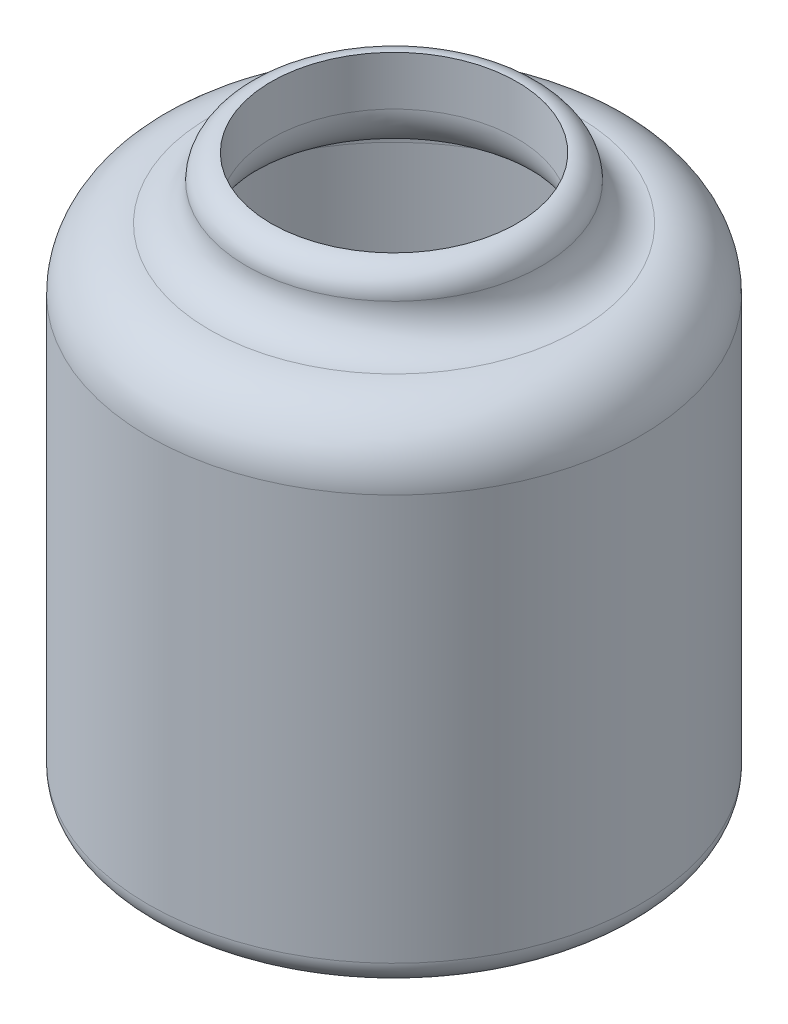
ISO-10303-21;
HEADER;
FILE_DESCRIPTION(('STEP AP214'),'2;1');
FILE_NAME('part.step','',(''),(''),'','','');
FILE_SCHEMA(('AUTOMOTIVE_DESIGN { 1 0 10303 214 1 1 1 1 }'));
ENDSEC;
DATA;
#1=APPLICATION_CONTEXT('core data for automotive mechanical design processes');
#2=APPLICATION_PROTOCOL_DEFINITION('international standard','automotive_design',2000,#1);
#3=PRODUCT_CONTEXT('',#1,'mechanical');
#4=PRODUCT('Part','Part','',(#3));
#5=PRODUCT_RELATED_PRODUCT_CATEGORY('part','',(#4));
#6=PRODUCT_DEFINITION_FORMATION('','',#4);
#7=PRODUCT_DEFINITION_CONTEXT('part definition',#1,'design');
#8=PRODUCT_DEFINITION('design','',#6,#7);
#9=PRODUCT_DEFINITION_SHAPE('','',#8);
#10=(LENGTH_UNIT() NAMED_UNIT(*) SI_UNIT(.MILLI.,.METRE.));
#11=(NAMED_UNIT(*) PLANE_ANGLE_UNIT() SI_UNIT($,.RADIAN.));
#12=(NAMED_UNIT(*) SI_UNIT($,.STERADIAN.) SOLID_ANGLE_UNIT());
#13=UNCERTAINTY_MEASURE_WITH_UNIT(LENGTH_MEASURE(1.E-05),#10,'distance_accuracy_value','');
#14=(GEOMETRIC_REPRESENTATION_CONTEXT(3) GLOBAL_UNCERTAINTY_ASSIGNED_CONTEXT((#13)) GLOBAL_UNIT_ASSIGNED_CONTEXT((#10,
#11,#12)) REPRESENTATION_CONTEXT('',''));
#15=CARTESIAN_POINT('',(0.,0.,0.));
#16=DIRECTION('',(0.,0.,1.));
#17=DIRECTION('',(1.,0.,0.));
#18=AXIS2_PLACEMENT_3D('',#15,#16,#17);
#19=CARTESIAN_POINT('',(0.,200.,0.));
#20=DIRECTION('',(0.,-1.,0.));
#21=DIRECTION('',(0.,0.,-1.));
#22=AXIS2_PLACEMENT_3D('',#19,#20,#21);
#23=CYLINDRICAL_SURFACE('',#22,100.);
#24=CARTESIAN_POINT('',(0.,175.,0.));
#25=DIRECTION('',(0.,1.,0.));
#26=DIRECTION('',(0.,0.,1.));
#27=AXIS2_PLACEMENT_3D('',#24,#25,#26);
#28=CIRCLE('',#27,100.);
#29=CARTESIAN_POINT('',(0.,175.,100.));
#30=VERTEX_POINT('',#29);
#31=EDGE_CURVE('E67',#30,#30,#28,.F.);
#32=ORIENTED_EDGE('',*,*,#31,.T.);
#33=EDGE_LOOP('',(#32));
#34=FACE_BOUND('',#33,.T.);
#35=CARTESIAN_POINT('',(0.,10.,0.));
#36=DIRECTION('',(0.,1.,0.));
#37=DIRECTION('',(0.,0.,1.));
#38=AXIS2_PLACEMENT_3D('',#35,#36,#37);
#39=CIRCLE('',#38,100.);
#40=CARTESIAN_POINT('',(0.,10.,100.));
#41=VERTEX_POINT('',#40);
#42=EDGE_CURVE('E83',#41,#41,#39,.T.);
#43=ORIENTED_EDGE('',*,*,#42,.T.);
#44=EDGE_LOOP('',(#43));
#45=FACE_BOUND('',#44,.T.);
#46=ADVANCED_FACE('F39',(#34,#45),#23,.T.);
#47=CARTESIAN_POINT('',(0.,0.,0.));
#48=DIRECTION('',(0.,1.,0.));
#49=DIRECTION('',(0.,0.,1.));
#50=AXIS2_PLACEMENT_3D('',#47,#48,#49);
#51=PLANE('',#50);
#52=CARTESIAN_POINT('',(0.,0.,0.));
#53=DIRECTION('',(0.,1.,0.));
#54=DIRECTION('',(0.,0.,1.));
#55=AXIS2_PLACEMENT_3D('',#52,#53,#54);
#56=CIRCLE('',#55,90.);
#57=CARTESIAN_POINT('',(0.,0.,90.));
#58=VERTEX_POINT('',#57);
#59=EDGE_CURVE('E79',#58,#58,#56,.F.);
#60=ORIENTED_EDGE('',*,*,#59,.T.);
#61=EDGE_LOOP('',(#60));
#62=FACE_BOUND('',#61,.T.);
#63=ADVANCED_FACE('F111',(#62),#51,.F.);
#64=CARTESIAN_POINT('',(0.,15.,0.));
#65=DIRECTION('',(0.,1.,0.));
#66=DIRECTION('',(0.,0.,1.));
#67=AXIS2_PLACEMENT_3D('',#64,#65,#66);
#68=CYLINDRICAL_SURFACE('',#67,50.);
#69=CARTESIAN_POINT('',(0.,205.,0.));
#70=DIRECTION('',(0.,1.,0.));
#71=DIRECTION('',(0.,0.,1.));
#72=AXIS2_PLACEMENT_3D('',#69,#70,#71);
#73=CIRCLE('',#72,50.);
#74=CARTESIAN_POINT('',(0.,205.,50.));
#75=VERTEX_POINT('',#74);
#76=EDGE_CURVE('E52',#75,#75,#73,.F.);
#77=ORIENTED_EDGE('',*,*,#76,.T.);
#78=EDGE_LOOP('',(#77));
#79=FACE_BOUND('',#78,.T.);
#80=CARTESIAN_POINT('',(0.,225.,0.));
#81=DIRECTION('',(0.,1.,0.));
#82=DIRECTION('',(0.,0.,1.));
#83=AXIS2_PLACEMENT_3D('',#80,#81,#82);
#84=CIRCLE('',#83,50.);
#85=CARTESIAN_POINT('',(0.,225.,50.));
#86=VERTEX_POINT('',#85);
#87=EDGE_CURVE('E87',#86,#86,#84,.T.);
#88=ORIENTED_EDGE('',*,*,#87,.T.);
#89=EDGE_LOOP('',(#88));
#90=FACE_BOUND('',#89,.T.);
#91=ADVANCED_FACE('F92',(#79,#90),#68,.F.);
#92=CARTESIAN_POINT('',(0.,10.,0.));
#93=DIRECTION('',(0.,1.,0.));
#94=DIRECTION('',(0.,0.,1.));
#95=AXIS2_PLACEMENT_3D('',#92,#93,#94);
#96=TOROIDAL_SURFACE('',#95,90.,10.);
#97=ORIENTED_EDGE('',*,*,#59,.F.);
#98=EDGE_LOOP('',(#97));
#99=FACE_BOUND('',#98,.T.);
#100=ORIENTED_EDGE('',*,*,#42,.F.);
#101=EDGE_LOOP('',(#100));
#102=FACE_BOUND('',#101,.T.);
#103=ADVANCED_FACE('F97',(#99,#102),#96,.T.);
#104=CARTESIAN_POINT('',(0.,215.,0.));
#105=DIRECTION('',(0.,1.,0.));
#106=DIRECTION('',(0.,0.,1.));
#107=AXIS2_PLACEMENT_3D('',#104,#105,#106);
#108=TOROIDAL_SURFACE('',#107,50.,10.);
#109=CARTESIAN_POINT('',(0.,215.,0.));
#110=DIRECTION('',(0.,1.,0.));
#111=DIRECTION('',(0.,0.,1.));
#112=AXIS2_PLACEMENT_3D('',#109,#110,#111);
#113=CIRCLE('',#112,60.);
#114=CARTESIAN_POINT('',(0.,215.,60.));
#115=VERTEX_POINT('',#114);
#116=EDGE_CURVE('E75',#115,#115,#113,.F.);
#117=ORIENTED_EDGE('',*,*,#116,.F.);
#118=EDGE_LOOP('',(#117));
#119=FACE_BOUND('',#118,.T.);
#120=ORIENTED_EDGE('',*,*,#87,.F.);
#121=EDGE_LOOP('',(#120));
#122=FACE_BOUND('',#121,.T.);
#123=ADVANCED_FACE('F94',(#119,#122),#108,.T.);
#124=CARTESIAN_POINT('',(0.,215.,0.));
#125=DIRECTION('',(0.,1.,0.));
#126=DIRECTION('',(0.,0.,1.));
#127=AXIS2_PLACEMENT_3D('',#124,#125,#126);
#128=TOROIDAL_SURFACE('',#127,75.,15.);
#129=CARTESIAN_POINT('',(0.,200.,0.));
#130=DIRECTION('',(0.,1.,0.));
#131=DIRECTION('',(0.,0.,1.));
#132=AXIS2_PLACEMENT_3D('',#129,#130,#131);
#133=CIRCLE('',#132,75.);
#134=CARTESIAN_POINT('',(0.,200.,75.));
#135=VERTEX_POINT('',#134);
#136=EDGE_CURVE('E71',#135,#135,#133,.F.);
#137=ORIENTED_EDGE('',*,*,#136,.F.);
#138=EDGE_LOOP('',(#137));
#139=FACE_BOUND('',#138,.T.);
#140=ORIENTED_EDGE('',*,*,#116,.T.);
#141=EDGE_LOOP('',(#140));
#142=FACE_BOUND('',#141,.T.);
#143=ADVANCED_FACE('F96',(#139,#142),#128,.F.);
#144=CARTESIAN_POINT('',(0.,175.,0.));
#145=DIRECTION('',(0.,1.,0.));
#146=DIRECTION('',(0.,0.,1.));
#147=AXIS2_PLACEMENT_3D('',#144,#145,#146);
#148=TOROIDAL_SURFACE('',#147,75.,25.);
#149=ORIENTED_EDGE('',*,*,#31,.F.);
#150=EDGE_LOOP('',(#149));
#151=FACE_BOUND('',#150,.T.);
#152=ORIENTED_EDGE('',*,*,#136,.T.);
#153=EDGE_LOOP('',(#152));
#154=FACE_BOUND('',#153,.T.);
#155=ADVANCED_FACE('F104',(#151,#154),#148,.T.);
#156=CARTESIAN_POINT('',(0.,185.,0.));
#157=DIRECTION('',(0.,-1.,0.));
#158=DIRECTION('',(0.,0.,-1.));
#159=AXIS2_PLACEMENT_3D('',#156,#157,#158);
#160=CYLINDRICAL_SURFACE('',#159,90.);
#161=CARTESIAN_POINT('',(0.,25.,0.));
#162=DIRECTION('',(0.,1.,0.));
#163=DIRECTION('',(0.,0.,1.));
#164=AXIS2_PLACEMENT_3D('',#161,#162,#163);
#165=CIRCLE('',#164,90.);
#166=CARTESIAN_POINT('',(0.,25.,90.));
#167=VERTEX_POINT('',#166);
#168=EDGE_CURVE('E10',#167,#167,#165,.F.);
#169=ORIENTED_EDGE('',*,*,#168,.T.);
#170=EDGE_LOOP('',(#169));
#171=FACE_BOUND('',#170,.T.);
#172=CARTESIAN_POINT('',(0.,165.,0.));
#173=DIRECTION('',(0.,1.,0.));
#174=DIRECTION('',(0.,0.,1.));
#175=AXIS2_PLACEMENT_3D('',#172,#173,#174);
#176=CIRCLE('',#175,90.);
#177=CARTESIAN_POINT('',(0.,165.,90.));
#178=VERTEX_POINT('',#177);
#179=EDGE_CURVE('E63',#178,#178,#176,.T.);
#180=ORIENTED_EDGE('',*,*,#179,.T.);
#181=EDGE_LOOP('',(#180));
#182=FACE_BOUND('',#181,.T.);
#183=ADVANCED_FACE('F128',(#171,#182),#160,.F.);
#184=CARTESIAN_POINT('',(0.,15.,0.));
#185=DIRECTION('',(0.,1.,0.));
#186=DIRECTION('',(0.,0.,1.));
#187=AXIS2_PLACEMENT_3D('',#184,#185,#186);
#188=PLANE('',#187);
#189=CARTESIAN_POINT('',(0.,15.,0.));
#190=DIRECTION('',(0.,1.,0.));
#191=DIRECTION('',(0.,0.,1.));
#192=AXIS2_PLACEMENT_3D('',#189,#190,#191);
#193=CIRCLE('',#192,80.);
#194=CARTESIAN_POINT('',(0.,15.,80.));
#195=VERTEX_POINT('',#194);
#196=EDGE_CURVE('E47',#195,#195,#193,.T.);
#197=ORIENTED_EDGE('',*,*,#196,.T.);
#198=EDGE_LOOP('',(#197));
#199=FACE_BOUND('',#198,.T.);
#200=ADVANCED_FACE('F124',(#199),#188,.T.);
#201=CARTESIAN_POINT('',(0.,165.,0.));
#202=DIRECTION('',(0.,1.,0.));
#203=DIRECTION('',(0.,0.,1.));
#204=AXIS2_PLACEMENT_3D('',#201,#202,#203);
#205=TOROIDAL_SURFACE('',#204,70.,20.);
#206=CARTESIAN_POINT('',(0.,185.,0.));
#207=DIRECTION('',(0.,1.,0.));
#208=DIRECTION('',(0.,0.,1.));
#209=AXIS2_PLACEMENT_3D('',#206,#207,#208);
#210=CIRCLE('',#209,70.);
#211=CARTESIAN_POINT('',(0.,185.,70.));
#212=VERTEX_POINT('',#211);
#213=EDGE_CURVE('E57',#212,#212,#210,.F.);
#214=ORIENTED_EDGE('',*,*,#213,.F.);
#215=EDGE_LOOP('',(#214));
#216=FACE_BOUND('',#215,.T.);
#217=ORIENTED_EDGE('',*,*,#179,.F.);
#218=EDGE_LOOP('',(#217));
#219=FACE_BOUND('',#218,.T.);
#220=ADVANCED_FACE('F127',(#216,#219),#205,.F.);
#221=CARTESIAN_POINT('',(0.,205.,0.));
#222=DIRECTION('',(0.,1.,0.));
#223=DIRECTION('',(0.,0.,1.));
#224=AXIS2_PLACEMENT_3D('',#221,#222,#223);
#225=TOROIDAL_SURFACE('',#224,70.,20.);
#226=ORIENTED_EDGE('',*,*,#213,.T.);
#227=EDGE_LOOP('',(#226));
#228=FACE_BOUND('',#227,.T.);
#229=ORIENTED_EDGE('',*,*,#76,.F.);
#230=EDGE_LOOP('',(#229));
#231=FACE_BOUND('',#230,.T.);
#232=ADVANCED_FACE('F139',(#228,#231),#225,.T.);
#233=CARTESIAN_POINT('',(0.,25.,0.));
#234=DIRECTION('',(0.,1.,0.));
#235=DIRECTION('',(0.,0.,1.));
#236=AXIS2_PLACEMENT_3D('',#233,#234,#235);
#237=TOROIDAL_SURFACE('',#236,80.,10.);
#238=ORIENTED_EDGE('',*,*,#168,.F.);
#239=EDGE_LOOP('',(#238));
#240=FACE_BOUND('',#239,.T.);
#241=ORIENTED_EDGE('',*,*,#196,.F.);
#242=EDGE_LOOP('',(#241));
#243=FACE_BOUND('',#242,.T.);
#244=ADVANCED_FACE('F41',(#240,#243),#237,.F.);
#245=CLOSED_SHELL('',(#46,#63,#91,#103,#123,#143,#155,#183,#200,#220,#232,#244));
#246=MANIFOLD_SOLID_BREP('B2',#245);
#247=ADVANCED_BREP_SHAPE_REPRESENTATION('',(#18,#246),#14);
#248=SHAPE_DEFINITION_REPRESENTATION(#9,#247);
ENDSEC;
END-ISO-10303-21;
